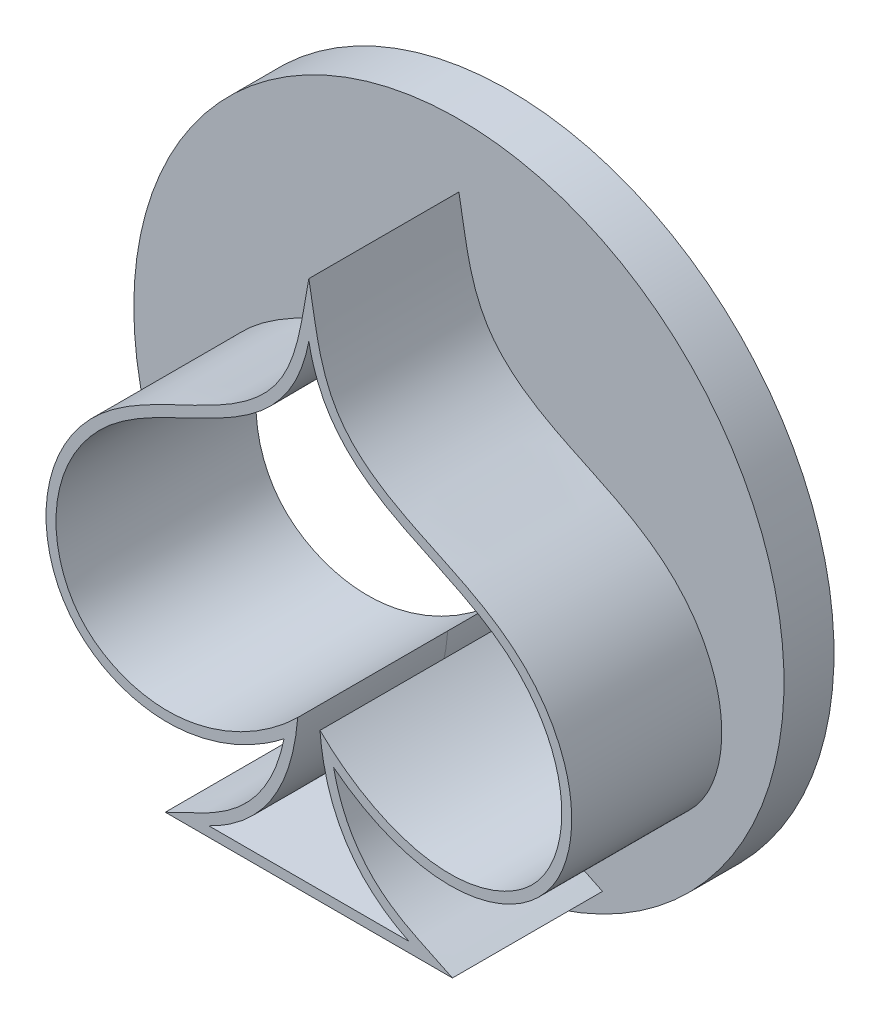
ISO-10303-21;
HEADER;
FILE_DESCRIPTION(('STEP AP214'),'2;1');
FILE_NAME('part.step','',(''),(''),'','','');
FILE_SCHEMA(('AUTOMOTIVE_DESIGN { 1 0 10303 214 1 1 1 1 }'));
ENDSEC;
DATA;
#1=APPLICATION_CONTEXT('core data for automotive mechanical design processes');
#2=APPLICATION_PROTOCOL_DEFINITION('international standard','automotive_design',2000,#1);
#3=PRODUCT_CONTEXT('',#1,'mechanical');
#4=PRODUCT('Part','Part','',(#3));
#5=PRODUCT_RELATED_PRODUCT_CATEGORY('part','',(#4));
#6=PRODUCT_DEFINITION_FORMATION('','',#4);
#7=PRODUCT_DEFINITION_CONTEXT('part definition',#1,'design');
#8=PRODUCT_DEFINITION('design','',#6,#7);
#9=PRODUCT_DEFINITION_SHAPE('','',#8);
#10=(LENGTH_UNIT() NAMED_UNIT(*) SI_UNIT(.MILLI.,.METRE.));
#11=(NAMED_UNIT(*) PLANE_ANGLE_UNIT() SI_UNIT($,.RADIAN.));
#12=(NAMED_UNIT(*) SI_UNIT($,.STERADIAN.) SOLID_ANGLE_UNIT());
#13=UNCERTAINTY_MEASURE_WITH_UNIT(LENGTH_MEASURE(1.E-05),#10,'distance_accuracy_value','');
#14=(GEOMETRIC_REPRESENTATION_CONTEXT(3) GLOBAL_UNCERTAINTY_ASSIGNED_CONTEXT((#13)) GLOBAL_UNIT_ASSIGNED_CONTEXT((#10,
#11,#12)) REPRESENTATION_CONTEXT('',''));
#15=CARTESIAN_POINT('',(0.,0.,0.));
#16=DIRECTION('',(0.,0.,1.));
#17=DIRECTION('',(1.,0.,0.));
#18=AXIS2_PLACEMENT_3D('',#15,#16,#17);
#19=CARTESIAN_POINT('',(-1.28515027166938,0.736448594879229,3.));
#20=DIRECTION('',(0.,0.,1.));
#21=DIRECTION('',(1.,0.,0.));
#22=AXIS2_PLACEMENT_3D('',#19,#20,#21);
#23=PLANE('',#22);
#24=CARTESIAN_POINT('',(-0.494956522938412,2.25945613840665,3.));
#25=CARTESIAN_POINT('',(-0.640678292168768,1.55412408020092,3.));
#26=CARTESIAN_POINT('',(-1.25977908193702,0.714931464463592,3.));
#27=CARTESIAN_POINT('',(-1.8707479629013,0.278116546356921,3.));
#28=CARTESIAN_POINT('',(-2.5381807117026,-0.0364384497359075,3.));
#29=CARTESIAN_POINT('',(-2.87074217972203,-0.2,3.));
#30=B_SPLINE_CURVE_WITH_KNOTS('',2,(#24,#25,#26,#27,#28,#29),.UNSPECIFIED.,.F.,.F.,(3,1,1,1,3),
(-0.242380713308049,0.169631082778639,0.444305613503099,0.650311511546443,0.856317409589788),.UNSPECIFIED.);
#31=CARTESIAN_POINT('',(-0.494956522938412,2.25945613840665,3.));
#32=VERTEX_POINT('',#31);
#33=CARTESIAN_POINT('',(-2.87074217972203,-0.2,3.));
#34=VERTEX_POINT('',#33);
#35=EDGE_CURVE('E308',#32,#34,#30,.T.);
#36=ORIENTED_EDGE('',*,*,#35,.T.);
#37=DIRECTION('',(1.,0.,0.));
#38=VECTOR('',#37,1.);
#39=CARTESIAN_POINT('',(2.87074217972204,-0.200000000000003,3.));
#40=LINE('',#39,#38);
#41=CARTESIAN_POINT('',(2.87074217972204,-0.200000000000003,3.));
#42=VERTEX_POINT('',#41);
#43=EDGE_CURVE('E332',#34,#42,#40,.T.);
#44=ORIENTED_EDGE('',*,*,#43,.T.);
#45=CARTESIAN_POINT('',(2.87074217972204,-0.200000000000003,3.));
#46=CARTESIAN_POINT('',(2.53818071170261,-0.0364384497359103,3.));
#47=CARTESIAN_POINT('',(1.87074796290131,0.278116546356918,3.));
#48=CARTESIAN_POINT('',(1.25977908193702,0.714931464463591,3.));
#49=CARTESIAN_POINT('',(0.640678292168768,1.55412408020092,3.));
#50=CARTESIAN_POINT('',(0.494956522938412,2.25945613840665,3.));
#51=B_SPLINE_CURVE_WITH_KNOTS('',2,(#45,#46,#47,#48,#49,#50),.UNSPECIFIED.,.F.,.F.,(3,1,1,1,3),
(-0.242380713308051,-0.0363748152647065,0.169631082778638,0.444305613503098,0.856317409589788),.UNSPECIFIED.);
#52=CARTESIAN_POINT('',(0.494956522938412,2.25945613840665,3.));
#53=VERTEX_POINT('',#52);
#54=EDGE_CURVE('E329',#42,#53,#51,.T.);
#55=ORIENTED_EDGE('',*,*,#54,.T.);
#56=CARTESIAN_POINT('',(0.494956522938412,2.25945613840665,3.));
#57=CARTESIAN_POINT('',(0.998757074257411,1.86685386097343,3.));
#58=CARTESIAN_POINT('',(1.88650626976387,1.40820300280175,3.));
#59=CARTESIAN_POINT('',(3.19938862171504,1.34104177219629,3.));
#60=CARTESIAN_POINT('',(4.17960344732873,1.65362447461034,3.));
#61=CARTESIAN_POINT('',(4.94557325085865,2.35559702424426,3.));
#62=CARTESIAN_POINT('',(5.40186826022642,3.65429352301547,3.));
#63=CARTESIAN_POINT('',(5.0963399677719,4.99970760772158,3.));
#64=CARTESIAN_POINT('',(4.2679620305338,6.01849755245838,3.));
#65=CARTESIAN_POINT('',(3.48759809705787,6.56116783432404,3.));
#66=CARTESIAN_POINT('',(2.65056429548742,6.96736865480958,3.));
#67=CARTESIAN_POINT('',(1.82978690577659,7.34952389606943,3.));
#68=CARTESIAN_POINT('',(1.10495763586814,7.80017024316994,3.));
#69=CARTESIAN_POINT('',(0.533078904004996,8.40110061833601,3.));
#70=CARTESIAN_POINT('',(0.188909182730846,9.26334657201893,3.));
#71=CARTESIAN_POINT('',(0.0718362272986335,10.0919579296255,3.));
#72=CARTESIAN_POINT('',(0.,10.4746817202019,3.));
#73=B_SPLINE_CURVE_WITH_KNOTS('',3,(#56,#57,#58,#59,#60,#61,#62,#63,#64,#65,#66,#67,#68,#69,#70,
#71,#72),.UNSPECIFIED.,.F.,.F.,(4,1,1,1,1,1,1,1,1,1,1,1,1,1,4),(0.0376212456088501,
0.165142491198778,0.228903113993743,0.292663736788707,0.356424359583671,0.420184982378635,
0.547706227968564,0.611466850763528,0.675227473558492,0.738988096353457,0.802748719148421,
0.866509341943385,0.930269964738349,0.994030587533313,1.05779121032828),.UNSPECIFIED.);
#74=CARTESIAN_POINT('',(0.,10.4746817202019,3.));
#75=VERTEX_POINT('',#74);
#76=EDGE_CURVE('E262',#53,#75,#73,.T.);
#77=ORIENTED_EDGE('',*,*,#76,.T.);
#78=CARTESIAN_POINT('',(0.,10.4746817202019,3.));
#79=CARTESIAN_POINT('',(-0.0718362272986337,10.0919579296255,3.));
#80=CARTESIAN_POINT('',(-0.188909182730845,9.26334657201893,3.));
#81=CARTESIAN_POINT('',(-0.533078904004996,8.40110061833601,3.));
#82=CARTESIAN_POINT('',(-1.10495763586814,7.80017024316994,3.));
#83=CARTESIAN_POINT('',(-1.82978690577659,7.34952389606943,3.));
#84=CARTESIAN_POINT('',(-2.65056429548742,6.96736865480958,3.));
#85=CARTESIAN_POINT('',(-3.48759809705787,6.56116783432403,3.));
#86=CARTESIAN_POINT('',(-4.2679620305338,6.01849755245838,3.));
#87=CARTESIAN_POINT('',(-5.09633996777191,4.99970760772158,3.));
#88=CARTESIAN_POINT('',(-5.40186826022642,3.65429352301547,3.));
#89=CARTESIAN_POINT('',(-4.94557325085865,2.35559702424426,3.));
#90=CARTESIAN_POINT('',(-4.17960344732873,1.65362447461034,3.));
#91=CARTESIAN_POINT('',(-3.19938862171504,1.34104177219629,3.));
#92=CARTESIAN_POINT('',(-1.88650626976387,1.40820300280175,3.));
#93=CARTESIAN_POINT('',(-0.99875707425741,1.86685386097343,3.));
#94=CARTESIAN_POINT('',(-0.494956522938412,2.25945613840665,3.));
#95=B_SPLINE_CURVE_WITH_KNOTS('',3,(#78,#79,#80,#81,#82,#83,#84,#85,#86,#87,#88,#89,#90,#91,#92,
#93,#94),.UNSPECIFIED.,.F.,.F.,(4,1,1,1,1,1,1,1,1,1,1,1,1,1,4),(0.03762124560885,
0.101381868403814,0.165142491198778,0.228903113993743,0.292663736788707,0.356424359583671,
0.420184982378635,0.4839456051736,0.547706227968564,0.675227473558492,0.738988096353456,
0.802748719148421,0.866509341943385,0.930269964738349,1.05779121032828),.UNSPECIFIED.);
#96=EDGE_CURVE('E255',#75,#32,#95,.T.);
#97=ORIENTED_EDGE('',*,*,#96,.T.);
#98=EDGE_LOOP('',(#36,#44,#55,#77,#97));
#99=FACE_BOUND('',#98,.T.);
#100=CARTESIAN_POINT('',(0.,9.39052910293571,3.));
#101=CARTESIAN_POINT('',(-0.434868056542186,7.07367092066314,3.));
#102=CARTESIAN_POINT('',(-3.27332031845501,7.09812649972264,3.));
#103=CARTESIAN_POINT('',(-4.96582828834832,4.80046080988698,3.));
#104=CARTESIAN_POINT('',(-5.15936116752048,3.42594853175549,3.));
#105=CARTESIAN_POINT('',(-4.59672066333842,2.1021145370711,3.));
#106=CARTESIAN_POINT('',(-2.63249516843848,1.17067032531659,3.));
#107=CARTESIAN_POINT('',(-0.980618286637176,2.01669958052137,3.));
#108=CARTESIAN_POINT('',(-0.222681985542157,2.76356171091485,3.));
#109=B_SPLINE_CURVE_WITH_KNOTS('',3,(#100,#101,#102,#103,#104,#105,#106,#107,#108),
.UNSPECIFIED.,.F.,.F.,(4,1,1,1,1,1,4),(0.,0.383556228998472,0.480101645091423,0.580039305715825,
0.663614347310343,0.766755591841274,1.),.UNSPECIFIED.);
#110=CARTESIAN_POINT('',(0.,9.39052910293571,3.));
#111=VERTEX_POINT('',#110);
#112=CARTESIAN_POINT('',(-0.222681985542157,2.76356171091485,3.));
#113=VERTEX_POINT('',#112);
#114=EDGE_CURVE('E227',#111,#113,#109,.T.);
#115=ORIENTED_EDGE('',*,*,#114,.F.);
#116=CARTESIAN_POINT('',(0.222681985542157,2.76356171091485,3.));
#117=CARTESIAN_POINT('',(0.980618286637177,2.01669958052137,3.));
#118=CARTESIAN_POINT('',(2.63249516843848,1.17067032531659,3.));
#119=CARTESIAN_POINT('',(4.59672066333842,2.1021145370711,3.));
#120=CARTESIAN_POINT('',(5.15936116752048,3.42594853175549,3.));
#121=CARTESIAN_POINT('',(4.96582828834832,4.80046080988698,3.));
#122=CARTESIAN_POINT('',(3.27332031845501,7.09812649972264,3.));
#123=CARTESIAN_POINT('',(0.434868056542188,7.07367092066314,3.));
#124=CARTESIAN_POINT('',(0.,9.39052910293571,3.));
#125=B_SPLINE_CURVE_WITH_KNOTS('',3,(#116,#117,#118,#119,#120,#121,#122,#123,#124),
.UNSPECIFIED.,.F.,.F.,(4,1,1,1,1,1,4),(0.,0.233244408158726,0.336385652689657,0.419960694284175,
0.519898354908577,0.616443771001528,1.),.UNSPECIFIED.);
#126=CARTESIAN_POINT('',(0.222681985542157,2.76356171091485,3.));
#127=VERTEX_POINT('',#126);
#128=EDGE_CURVE('E221',#127,#111,#125,.T.);
#129=ORIENTED_EDGE('',*,*,#128,.F.);
#130=CARTESIAN_POINT('',(2.,0.,3.));
#131=CARTESIAN_POINT('',(0.383801434932143,0.783797297675232,3.));
#132=CARTESIAN_POINT('',(0.222681985542157,2.76356171091485,3.));
#133=B_SPLINE_CURVE_WITH_KNOTS('',2,(#130,#131,#132),.UNSPECIFIED.,.F.,.F.,(3,3),(0.,1.),.UNSPECIFIED.);
#134=CARTESIAN_POINT('',(2.,0.,3.));
#135=VERTEX_POINT('',#134);
#136=EDGE_CURVE('E385',#135,#127,#133,.T.);
#137=ORIENTED_EDGE('',*,*,#136,.F.);
#138=DIRECTION('',(1.,0.,0.));
#139=VECTOR('',#138,1.);
#140=CARTESIAN_POINT('',(2.,0.,3.));
#141=LINE('',#140,#139);
#142=CARTESIAN_POINT('',(-2.,0.,3.));
#143=VERTEX_POINT('',#142);
#144=EDGE_CURVE('E406',#143,#135,#141,.T.);
#145=ORIENTED_EDGE('',*,*,#144,.F.);
#146=CARTESIAN_POINT('',(-0.222681985542157,2.76356171091485,3.));
#147=CARTESIAN_POINT('',(-0.383801434932143,0.783797297675232,3.));
#148=CARTESIAN_POINT('',(-2.,0.,3.));
#149=B_SPLINE_CURVE_WITH_KNOTS('',2,(#146,#147,#148),.UNSPECIFIED.,.F.,.F.,(3,3),(0.,1.),.UNSPECIFIED.);
#150=EDGE_CURVE('E421',#113,#143,#149,.T.);
#151=ORIENTED_EDGE('',*,*,#150,.F.);
#152=EDGE_LOOP('',(#115,#129,#137,#145,#151));
#153=FACE_BOUND('',#152,.T.);
#154=ADVANCED_FACE('F39',(#99,#153),#23,.T.);
#155=DIRECTION('',(0.,0.,-1.));
#156=VECTOR('',#155,1.);
#157=SURFACE_OF_LINEAR_EXTRUSION('',#30,#156);
#158=CARTESIAN_POINT('',(-0.494956522938412,2.25945613840665,0.));
#159=CARTESIAN_POINT('',(-0.640678292168768,1.55412408020092,0.));
#160=CARTESIAN_POINT('',(-1.25977908193702,0.714931464463592,0.));
#161=CARTESIAN_POINT('',(-1.8707479629013,0.278116546356921,0.));
#162=CARTESIAN_POINT('',(-2.5381807117026,-0.0364384497359075,0.));
#163=CARTESIAN_POINT('',(-2.87074217972203,-0.2,0.));
#164=B_SPLINE_CURVE_WITH_KNOTS('',2,(#158,#159,#160,#161,#162,#163),.UNSPECIFIED.,.F.,.F.,(3,1,
1,1,3),(-0.242380713308049,0.169631082778639,0.444305613503099,0.650311511546443,
0.856317409589788),.UNSPECIFIED.);
#165=CARTESIAN_POINT('',(-0.494956522938412,2.25945613840665,0.));
#166=VERTEX_POINT('',#165);
#167=CARTESIAN_POINT('',(-2.87074217972203,-0.2,0.));
#168=VERTEX_POINT('',#167);
#169=EDGE_CURVE('E267',#166,#168,#164,.T.);
#170=ORIENTED_EDGE('',*,*,#169,.T.);
#171=DIRECTION('',(0.,0.,-1.));
#172=VECTOR('',#171,1.);
#173=CARTESIAN_POINT('',(-2.87074217972203,-0.2,3.));
#174=LINE('',#173,#172);
#175=EDGE_CURVE('E11',#34,#168,#174,.T.);
#176=ORIENTED_EDGE('',*,*,#175,.F.);
#177=ORIENTED_EDGE('',*,*,#35,.F.);
#178=DIRECTION('',(0.,0.,-1.));
#179=VECTOR('',#178,1.);
#180=CARTESIAN_POINT('',(-0.494956522938412,2.25945613840665,3.));
#181=LINE('',#180,#179);
#182=EDGE_CURVE('E261',#32,#166,#181,.T.);
#183=ORIENTED_EDGE('',*,*,#182,.T.);
#184=EDGE_LOOP('',(#170,#176,#177,#183));
#185=FACE_BOUND('',#184,.T.);
#186=ADVANCED_FACE('F41',(#185),#157,.F.);
#187=CARTESIAN_POINT('',(2.87074217972204,-0.200000000000003,3.));
#188=DIRECTION('',(0.,1.,0.));
#189=DIRECTION('',(-1.,0.,0.));
#190=AXIS2_PLACEMENT_3D('',#187,#188,#189);
#191=PLANE('',#190);
#192=DIRECTION('',(1.,0.,0.));
#193=VECTOR('',#192,1.);
#194=CARTESIAN_POINT('',(2.87074217972204,-0.200000000000003,0.));
#195=LINE('',#194,#193);
#196=CARTESIAN_POINT('',(2.87074217972204,-0.200000000000003,0.));
#197=VERTEX_POINT('',#196);
#198=EDGE_CURVE('E276',#168,#197,#195,.T.);
#199=ORIENTED_EDGE('',*,*,#198,.T.);
#200=DIRECTION('',(0.,0.,-1.));
#201=VECTOR('',#200,1.);
#202=CARTESIAN_POINT('',(2.87074217972204,-0.200000000000003,3.));
#203=LINE('',#202,#201);
#204=EDGE_CURVE('E49',#42,#197,#203,.T.);
#205=ORIENTED_EDGE('',*,*,#204,.F.);
#206=ORIENTED_EDGE('',*,*,#43,.F.);
#207=ORIENTED_EDGE('',*,*,#175,.T.);
#208=EDGE_LOOP('',(#199,#205,#206,#207));
#209=FACE_BOUND('',#208,.T.);
#210=ADVANCED_FACE('F331',(#209),#191,.F.);
#211=DIRECTION('',(0.,0.,-1.));
#212=VECTOR('',#211,1.);
#213=SURFACE_OF_LINEAR_EXTRUSION('',#51,#212);
#214=CARTESIAN_POINT('',(2.87074217972204,-0.200000000000003,0.));
#215=CARTESIAN_POINT('',(2.53818071170261,-0.0364384497359103,0.));
#216=CARTESIAN_POINT('',(1.87074796290131,0.278116546356918,0.));
#217=CARTESIAN_POINT('',(1.25977908193702,0.714931464463591,0.));
#218=CARTESIAN_POINT('',(0.640678292168768,1.55412408020092,0.));
#219=CARTESIAN_POINT('',(0.494956522938412,2.25945613840665,0.));
#220=B_SPLINE_CURVE_WITH_KNOTS('',2,(#214,#215,#216,#217,#218,#219),.UNSPECIFIED.,.F.,.F.,(3,1,
1,1,3),(-0.242380713308051,-0.0363748152647065,0.169631082778638,0.444305613503098,
0.856317409589788),.UNSPECIFIED.);
#221=CARTESIAN_POINT('',(0.494956522938412,2.25945613840665,0.));
#222=VERTEX_POINT('',#221);
#223=EDGE_CURVE('E284',#197,#222,#220,.T.);
#224=ORIENTED_EDGE('',*,*,#223,.T.);
#225=DIRECTION('',(0.,0.,-1.));
#226=VECTOR('',#225,1.);
#227=CARTESIAN_POINT('',(0.494956522938412,2.25945613840665,3.));
#228=LINE('',#227,#226);
#229=EDGE_CURVE('E319',#53,#222,#228,.T.);
#230=ORIENTED_EDGE('',*,*,#229,.F.);
#231=ORIENTED_EDGE('',*,*,#54,.F.);
#232=ORIENTED_EDGE('',*,*,#204,.T.);
#233=EDGE_LOOP('',(#224,#230,#231,#232));
#234=FACE_BOUND('',#233,.T.);
#235=ADVANCED_FACE('F327',(#234),#213,.F.);
#236=DIRECTION('',(0.,0.,-1.));
#237=VECTOR('',#236,1.);
#238=SURFACE_OF_LINEAR_EXTRUSION('',#73,#237);
#239=CARTESIAN_POINT('',(0.494956522938412,2.25945613840665,0.));
#240=CARTESIAN_POINT('',(0.998757074257411,1.86685386097343,0.));
#241=CARTESIAN_POINT('',(1.88650626976387,1.40820300280175,0.));
#242=CARTESIAN_POINT('',(3.19938862171504,1.34104177219629,0.));
#243=CARTESIAN_POINT('',(4.17960344732873,1.65362447461034,0.));
#244=CARTESIAN_POINT('',(4.94557325085865,2.35559702424426,0.));
#245=CARTESIAN_POINT('',(5.40186826022642,3.65429352301547,0.));
#246=CARTESIAN_POINT('',(5.0963399677719,4.99970760772158,0.));
#247=CARTESIAN_POINT('',(4.2679620305338,6.01849755245838,0.));
#248=CARTESIAN_POINT('',(3.48759809705787,6.56116783432404,0.));
#249=CARTESIAN_POINT('',(2.65056429548742,6.96736865480958,0.));
#250=CARTESIAN_POINT('',(1.82978690577659,7.34952389606943,0.));
#251=CARTESIAN_POINT('',(1.10495763586814,7.80017024316994,0.));
#252=CARTESIAN_POINT('',(0.533078904004996,8.40110061833601,0.));
#253=CARTESIAN_POINT('',(0.188909182730846,9.26334657201893,0.));
#254=CARTESIAN_POINT('',(0.0718362272986335,10.0919579296255,0.));
#255=CARTESIAN_POINT('',(0.,10.4746817202019,0.));
#256=B_SPLINE_CURVE_WITH_KNOTS('',3,(#239,#240,#241,#242,#243,#244,#245,#246,#247,#248,#249,
#250,#251,#252,#253,#254,#255),.UNSPECIFIED.,.F.,.F.,(4,1,1,1,1,1,1,1,1,1,1,1,1,1,4),
(0.0376212456088501,0.165142491198778,0.228903113993743,0.292663736788707,0.356424359583671,
0.420184982378635,0.547706227968564,0.611466850763528,0.675227473558492,0.738988096353457,
0.802748719148421,0.866509341943385,0.930269964738349,0.994030587533313,1.05779121032828),.UNSPECIFIED.);
#257=CARTESIAN_POINT('',(0.,10.4746817202019,0.));
#258=VERTEX_POINT('',#257);
#259=EDGE_CURVE('E290',#222,#258,#256,.T.);
#260=ORIENTED_EDGE('',*,*,#259,.T.);
#261=DIRECTION('',(0.,0.,-1.));
#262=VECTOR('',#261,1.);
#263=CARTESIAN_POINT('',(0.,10.4746817202019,3.));
#264=LINE('',#263,#262);
#265=EDGE_CURVE('E315',#75,#258,#264,.T.);
#266=ORIENTED_EDGE('',*,*,#265,.F.);
#267=ORIENTED_EDGE('',*,*,#76,.F.);
#268=ORIENTED_EDGE('',*,*,#229,.T.);
#269=EDGE_LOOP('',(#260,#266,#267,#268));
#270=FACE_BOUND('',#269,.T.);
#271=ADVANCED_FACE('F251',(#270),#238,.F.);
#272=DIRECTION('',(0.,0.,-1.));
#273=VECTOR('',#272,1.);
#274=SURFACE_OF_LINEAR_EXTRUSION('',#95,#273);
#275=CARTESIAN_POINT('',(0.,10.4746817202019,0.));
#276=CARTESIAN_POINT('',(-0.0718362272986337,10.0919579296255,0.));
#277=CARTESIAN_POINT('',(-0.188909182730845,9.26334657201893,0.));
#278=CARTESIAN_POINT('',(-0.533078904004996,8.40110061833601,0.));
#279=CARTESIAN_POINT('',(-1.10495763586814,7.80017024316994,0.));
#280=CARTESIAN_POINT('',(-1.82978690577659,7.34952389606943,0.));
#281=CARTESIAN_POINT('',(-2.65056429548742,6.96736865480958,0.));
#282=CARTESIAN_POINT('',(-3.48759809705787,6.56116783432403,0.));
#283=CARTESIAN_POINT('',(-4.2679620305338,6.01849755245838,0.));
#284=CARTESIAN_POINT('',(-5.09633996777191,4.99970760772158,0.));
#285=CARTESIAN_POINT('',(-5.40186826022642,3.65429352301547,0.));
#286=CARTESIAN_POINT('',(-4.94557325085865,2.35559702424426,0.));
#287=CARTESIAN_POINT('',(-4.17960344732873,1.65362447461034,0.));
#288=CARTESIAN_POINT('',(-3.19938862171504,1.34104177219629,0.));
#289=CARTESIAN_POINT('',(-1.88650626976387,1.40820300280175,0.));
#290=CARTESIAN_POINT('',(-0.99875707425741,1.86685386097343,0.));
#291=CARTESIAN_POINT('',(-0.494956522938412,2.25945613840665,0.));
#292=B_SPLINE_CURVE_WITH_KNOTS('',3,(#275,#276,#277,#278,#279,#280,#281,#282,#283,#284,#285,
#286,#287,#288,#289,#290,#291),.UNSPECIFIED.,.F.,.F.,(4,1,1,1,1,1,1,1,1,1,1,1,1,1,4),
(0.03762124560885,0.101381868403814,0.165142491198778,0.228903113993743,0.292663736788707,
0.356424359583671,0.420184982378635,0.4839456051736,0.547706227968564,0.675227473558492,
0.738988096353456,0.802748719148421,0.866509341943385,0.930269964738349,1.05779121032828),.UNSPECIFIED.);
#293=EDGE_CURVE('E299',#258,#166,#292,.T.);
#294=ORIENTED_EDGE('',*,*,#293,.T.);
#295=ORIENTED_EDGE('',*,*,#182,.F.);
#296=ORIENTED_EDGE('',*,*,#96,.F.);
#297=ORIENTED_EDGE('',*,*,#265,.T.);
#298=EDGE_LOOP('',(#294,#295,#296,#297));
#299=FACE_BOUND('',#298,.T.);
#300=ADVANCED_FACE('F242',(#299),#274,.F.);
#301=DIRECTION('',(0.,0.,-1.));
#302=VECTOR('',#301,1.);
#303=SURFACE_OF_LINEAR_EXTRUSION('',#125,#302);
#304=DIRECTION('',(0.,0.,-1.));
#305=VECTOR('',#304,1.);
#306=CARTESIAN_POINT('',(0.,9.39052910293571,3.));
#307=LINE('',#306,#305);
#308=CARTESIAN_POINT('',(0.,9.39052910293571,-1.));
#309=VERTEX_POINT('',#308);
#310=EDGE_CURVE('E277',#111,#309,#307,.T.);
#311=ORIENTED_EDGE('',*,*,#310,.T.);
#312=CARTESIAN_POINT('',(0.222681985542157,2.76356171091485,-1.));
#313=CARTESIAN_POINT('',(0.267622056781547,2.71928577677275,-1.));
#314=CARTESIAN_POINT('',(0.31349998928929,2.67597517329728,-1.));
#315=CARTESIAN_POINT('',(0.407029080906865,2.59131545631004,-1.));
#316=CARTESIAN_POINT('',(0.454680183953779,2.54996628087701,-1.));
#317=CARTESIAN_POINT('',(0.600249127704799,2.42881542700386,-1.));
#318=CARTESIAN_POINT('',(0.700684612769739,2.35200666738486,-1.));
#319=CARTESIAN_POINT('',(0.908916710004572,2.20606825255957,-1.));
#320=CARTESIAN_POINT('',(1.01679124628147,2.1370497907428,-1.));
#321=CARTESIAN_POINT('',(1.23815922963595,2.00885510242047,-1.));
#322=CARTESIAN_POINT('',(1.35164928833726,1.94967303244401,-1.));
#323=CARTESIAN_POINT('',(1.63121068259429,1.82051206900407,-1.));
#324=CARTESIAN_POINT('',(1.79985244673728,1.75597106292279,-1.));
#325=CARTESIAN_POINT('',(2.14464373163098,1.65421497623771,-1.));
#326=CARTESIAN_POINT('',(2.32075136533008,1.61686449594489,-0.999999999999999));
#327=CARTESIAN_POINT('',(2.57127168435125,1.58738390540625,-0.999999999999999));
#328=CARTESIAN_POINT('',(2.64418662916815,1.58157350623224,-1.));
#329=CARTESIAN_POINT('',(2.79023435217834,1.57578270171406,-1.));
#330=CARTESIAN_POINT('',(2.86336700595512,1.57579943762001,-1.));
#331=CARTESIAN_POINT('',(3.00949109954939,1.58197581681789,-1.));
#332=CARTESIAN_POINT('',(3.08248214783871,1.58814493049124,-1.));
#333=CARTESIAN_POINT('',(3.22764854248767,1.60687296775651,-1.));
#334=CARTESIAN_POINT('',(3.29982384835278,1.61943220715096,-1.));
#335=CARTESIAN_POINT('',(3.44311361458721,1.65092080324736,-1.));
#336=CARTESIAN_POINT('',(3.51422177914243,1.66987879198122,-1.));
#337=CARTESIAN_POINT('',(3.6544818226186,1.71406258599073,-1.));
#338=CARTESIAN_POINT('',(3.72363338166238,1.73928940961195,-1.));
#339=CARTESIAN_POINT('',(3.85923750467927,1.79600989605734,-1.));
#340=CARTESIAN_POINT('',(3.92569289939353,1.82749676998538,-1.));
#341=CARTESIAN_POINT('',(4.05519450806776,1.89683035595428,-1.));
#342=CARTESIAN_POINT('',(4.1182420775996,1.93467451420384,-1.));
#343=CARTESIAN_POINT('',(4.22303926305223,2.00535989871127,-1.));
#344=CARTESIAN_POINT('',(4.26583208309256,2.03666129919902,-1.));
#345=CARTESIAN_POINT('',(4.34874508352348,2.10261511741933,-1.));
#346=CARTESIAN_POINT('',(4.38886605944883,2.1372665300923,-1.));
#347=CARTESIAN_POINT('',(4.46591476387261,2.20981998508368,-1.));
#348=CARTESIAN_POINT('',(4.50284866519567,2.24771544695057,-1.));
#349=CARTESIAN_POINT('',(4.57313923560761,2.32669309410974,-1.));
#350=CARTESIAN_POINT('',(4.6064957203669,2.36777544342147,-1.));
#351=CARTESIAN_POINT('',(4.66951219221098,2.45256466403628,-1.));
#352=CARTESIAN_POINT('',(4.69917847026863,2.49626687515585,-1.));
#353=CARTESIAN_POINT('',(4.75487552784782,2.58591922954496,-1.));
#354=CARTESIAN_POINT('',(4.78090594580278,2.63186959576869,-1.));
#355=CARTESIAN_POINT('',(4.85368028864161,2.77268077437917,-1.));
#356=CARTESIAN_POINT('',(4.89501903603852,2.87038053560259,-1.));
#357=CARTESIAN_POINT('',(4.96655059814431,3.07903668008785,-1.));
#358=CARTESIAN_POINT('',(4.99549599225565,3.19041374706198,-1.));
#359=CARTESIAN_POINT('',(5.03702882968097,3.41608105485557,-1.));
#360=CARTESIAN_POINT('',(5.04962514091122,3.53036968208173,-1.));
#361=CARTESIAN_POINT('',(5.05966056695347,3.77794014091653,-1.));
#362=CARTESIAN_POINT('',(5.05434970905915,3.91133293662866,-1.));
#363=CARTESIAN_POINT('',(5.02366479875753,4.1758532126712,-1.));
#364=CARTESIAN_POINT('',(4.99827661704857,4.30697903119733,-1.));
#365=CARTESIAN_POINT('',(4.94438947804425,4.5065395851324,-1.));
#366=CARTESIAN_POINT('',(4.92235815158813,4.57678797040575,-1.));
#367=CARTESIAN_POINT('',(4.8727925050649,4.71531182689739,-1.));
#368=CARTESIAN_POINT('',(4.84525809412611,4.78358726551535,-1.));
#369=CARTESIAN_POINT('',(4.75475757598813,4.98496491424996,-1.));
#370=CARTESIAN_POINT('',(4.68389331160966,5.11462164174916,-1.));
#371=CARTESIAN_POINT('',(4.56071840363227,5.30583843240395,-1.));
#372=CARTESIAN_POINT('',(4.51462497239112,5.37155285153426,-1.));
#373=CARTESIAN_POINT('',(4.41754273540564,5.49929341869541,-1.));
#374=CARTESIAN_POINT('',(4.36655364409333,5.56131935123156,-1.));
#375=CARTESIAN_POINT('',(4.26017400629629,5.68126635216038,-1.));
#376=CARTESIAN_POINT('',(4.20479181722557,5.7391948362101,-1.));
#377=CARTESIAN_POINT('',(4.11862716379497,5.82287313302239,-1.));
#378=CARTESIAN_POINT('',(4.0893907470789,5.85022985698623,-1.));
#379=CARTESIAN_POINT('',(4.02991882470363,5.90383548913049,-1.));
#380=CARTESIAN_POINT('',(3.99968329461386,5.93008437018586,-1.));
#381=CARTESIAN_POINT('',(3.87158887125746,6.0373734895619,-1.));
#382=CARTESIAN_POINT('',(3.76957998062017,6.11350625026119,-1.));
#383=CARTESIAN_POINT('',(3.55928477397878,6.25655080499442,-1.));
#384=CARTESIAN_POINT('',(3.45099133752663,6.32345183775475,-1.));
#385=CARTESIAN_POINT('',(3.22981829259601,6.45080300284625,-1.));
#386=CARTESIAN_POINT('',(3.11691387129178,6.51120934396943,-1.));
#387=CARTESIAN_POINT('',(2.88900865978161,6.62772335899669,-1.));
#388=CARTESIAN_POINT('',(2.77400867543033,6.68383264389232,-1.));
#389=CARTESIAN_POINT('',(2.54045793752188,6.79582451769229,-1.));
#390=CARTESIAN_POINT('',(2.42188892925483,6.85166828859025,-1.));
#391=CARTESIAN_POINT('',(2.18529904660218,6.96462586035931,-1.));
#392=CARTESIAN_POINT('',(2.06727835011546,7.02174004277346,-1.));
#393=CARTESIAN_POINT('',(1.83382654430484,7.13992970391876,-1.));
#394=CARTESIAN_POINT('',(1.71838658138083,7.20098737262379,-1.));
#395=CARTESIAN_POINT('',(1.49156031598222,7.330236474864,-1.));
#396=CARTESIAN_POINT('',(1.38017125304895,7.39842292293337,-1.));
#397=CARTESIAN_POINT('',(1.20382247394499,7.51781597809433,-1.));
#398=CARTESIAN_POINT('',(1.13685560766636,7.56604259928834,-1.));
#399=CARTESIAN_POINT('',(1.00644321035488,7.66702468799005,-1.));
#400=CARTESIAN_POINT('',(0.942996199077976,7.71977822760337,-1.));
#401=CARTESIAN_POINT('',(0.820601685173918,7.83012546814743,-1.));
#402=CARTESIAN_POINT('',(0.761647674140455,7.88771190386748,-1.));
#403=CARTESIAN_POINT('',(0.649052943721855,8.00787471651368,-1.));
#404=CARTESIAN_POINT('',(0.595411652467803,8.07045055506148,-1.));
#405=CARTESIAN_POINT('',(0.493797267653571,8.2008903177362,-1.));
#406=CARTESIAN_POINT('',(0.445874559159919,8.26879359097577,-1.));
#407=CARTESIAN_POINT('',(0.35673741067147,8.40887844002312,-1.));
#408=CARTESIAN_POINT('',(0.31552380377321,8.4810605456352,-1.));
#409=CARTESIAN_POINT('',(0.239904102514157,8.62909619133101,-1.));
#410=CARTESIAN_POINT('',(0.205513399480177,8.70495756245296,-1.));
#411=CARTESIAN_POINT('',(0.143499716146948,8.85936317957292,-1.));
#412=CARTESIAN_POINT('',(0.115875116116354,8.93790677833489,-1.));
#413=CARTESIAN_POINT('',(0.0725462981032761,9.0787947564956,-1.));
#414=CARTESIAN_POINT('',(0.0555601791418356,9.1407522020407,-1.));
#415=CARTESIAN_POINT('',(0.0251884975628481,9.26522238623135,-1.));
#416=CARTESIAN_POINT('',(0.011785578281883,9.32773087503549,-1.));
#417=CARTESIAN_POINT('',(0.,9.39052910293571,-1.));
#418=B_SPLINE_CURVE_WITH_KNOTS('',3,(#312,#313,#314,#315,#316,#317,#318,#319,#320,#321,#322,
#323,#324,#325,#326,#327,#328,#329,#330,#331,#332,#333,#334,#335,#336,#337,#338,#339,#340,#341,
#342,#343,#344,#345,#346,#347,#348,#349,#350,#351,#352,#353,#354,#355,#356,#357,#358,#359,#360,
#361,#362,#363,#364,#365,#366,#367,#368,#369,#370,#371,#372,#373,#374,#375,#376,#377,#378,#379,
#380,#381,#382,#383,#384,#385,#386,#387,#388,#389,#390,#391,#392,#393,#394,#395,#396,#397,#398,
#399,#400,#401,#402,#403,#404,#405,#406,#407,#408,#409,#410,#411,#412,#413,#414,#415,#416,#417),
.UNSPECIFIED.,.F.,.F.,(4,2,2,2,2,2,2,2,2,2,2,2,2,2,2,2,2,2,2,2,2,2,2,2,2,2,2,2,2,2,2,2,2,2,2,2,
2,2,2,2,2,2,2,2,2,2,2,2,2,2,2,2,4),(0.,0.189228974810152,0.378451971780365,0.757308742315284,
1.14102730812844,1.52451709845056,2.06438178527939,2.60153938674879,2.82079141792841,
3.03993588581544,3.25941820519241,3.47891137252542,3.69940000613989,3.91992448063641,
4.14021109272373,4.36040942393762,4.51931178243406,4.67816661464569,4.83670652242361,
4.99525459519131,5.15352856288443,5.31181825887643,5.62884231889042,5.97283686289965,
6.31664474253005,6.7155040887789,7.11464438006798,7.33530205208209,7.55596336808725,
7.99727620247004,8.23790284977435,8.47854354157176,8.71873694015845,8.83883080914312,
8.9589276168687,9.34004287829272,9.72159871290073,10.1055842397815,10.4894250962516,
10.8826163035007,11.2759272364447,11.6675716498997,12.0589439786234,12.3063563047835,
12.5536637826079,12.8006059274385,13.0475214621007,13.2964729751223,13.5454553779279,
13.7949932117327,14.0444712503851,14.2371020744506,14.4287821755271),.UNSPECIFIED.);
#419=CARTESIAN_POINT('',(0.222681985542157,2.76356171091485,-1.));
#420=VERTEX_POINT('',#419);
#421=EDGE_CURVE('E197',#420,#309,#418,.T.);
#422=ORIENTED_EDGE('',*,*,#421,.F.);
#423=DIRECTION('',(0.,0.,1.));
#424=VECTOR('',#423,1.);
#425=CARTESIAN_POINT('',(0.222681985542157,2.76356171091485,-1.));
#426=LINE('',#425,#424);
#427=CARTESIAN_POINT('',(0.222681985542157,2.76356171091485,0.));
#428=VERTEX_POINT('',#427);
#429=EDGE_CURVE('E190',#420,#428,#426,.T.);
#430=ORIENTED_EDGE('',*,*,#429,.T.);
#431=DIRECTION('',(0.,0.,-1.));
#432=VECTOR('',#431,1.);
#433=CARTESIAN_POINT('',(0.222681985542157,2.76356171091485,3.));
#434=LINE('',#433,#432);
#435=EDGE_CURVE('E381',#127,#428,#434,.T.);
#436=ORIENTED_EDGE('',*,*,#435,.F.);
#437=ORIENTED_EDGE('',*,*,#128,.T.);
#438=EDGE_LOOP('',(#311,#422,#430,#436,#437));
#439=FACE_BOUND('',#438,.T.);
#440=ADVANCED_FACE('F237',(#439),#303,.T.);
#441=DIRECTION('',(0.,0.,-1.));
#442=VECTOR('',#441,1.);
#443=SURFACE_OF_LINEAR_EXTRUSION('',#109,#442);
#444=DIRECTION('',(0.,0.,-1.));
#445=VECTOR('',#444,1.);
#446=CARTESIAN_POINT('',(-0.222681985542157,2.76356171091485,3.));
#447=LINE('',#446,#445);
#448=CARTESIAN_POINT('',(-0.222681985542157,2.76356171091485,0.));
#449=VERTEX_POINT('',#448);
#450=EDGE_CURVE('E372',#113,#449,#447,.T.);
#451=ORIENTED_EDGE('',*,*,#450,.T.);
#452=DIRECTION('',(0.,0.,-1.));
#453=VECTOR('',#452,1.);
#454=CARTESIAN_POINT('',(-0.222681985542157,2.76356171091485,-1.));
#455=LINE('',#454,#453);
#456=CARTESIAN_POINT('',(-0.222681985542157,2.76356171091485,-1.));
#457=VERTEX_POINT('',#456);
#458=EDGE_CURVE('E184',#457,#449,#455,.F.);
#459=ORIENTED_EDGE('',*,*,#458,.F.);
#460=CARTESIAN_POINT('',(0.,9.39052910293571,-1.));
#461=CARTESIAN_POINT('',(-0.0112002040403278,9.33084747882254,-1.));
#462=CARTESIAN_POINT('',(-0.0238625911357684,9.27142452257609,-1.));
#463=CARTESIAN_POINT('',(-0.0523610928825155,9.15320499775834,-1.));
#464=CARTESIAN_POINT('',(-0.0682043105765255,9.09441014692283,-1.));
#465=CARTESIAN_POINT('',(-0.103276115111434,8.9777914504718,-1.));
#466=CARTESIAN_POINT('',(-0.122506798494655,8.91996823062904,-1.));
#467=CARTESIAN_POINT('',(-0.164356078562471,8.80607412473955,-1.));
#468=CARTESIAN_POINT('',(-0.186946764634291,8.74999301630482,-1.));
#469=CARTESIAN_POINT('',(-0.235722526660977,8.63945837308705,-1.));
#470=CARTESIAN_POINT('',(-0.261905001604738,8.58500369495222,-1.));
#471=CARTESIAN_POINT('',(-0.317891729303107,8.47802023871611,-1.));
#472=CARTESIAN_POINT('',(-0.347694445984739,8.42549065602447,-1.));
#473=CARTESIAN_POINT('',(-0.423553569630922,8.30198754851917,-1.));
#474=CARTESIAN_POINT('',(-0.471335715910218,8.23206383319226,-1.));
#475=CARTESIAN_POINT('',(-0.573436571248097,8.09715416568422,-1.));
#476=CARTESIAN_POINT('',(-0.627757098569744,8.03216959526813,-1.));
#477=CARTESIAN_POINT('',(-0.741954154441386,7.90763674904036,-1.));
#478=CARTESIAN_POINT('',(-0.80181470867272,7.84807376831719,-1.));
#479=CARTESIAN_POINT('',(-0.926219751028162,7.73414303965772,-1.));
#480=CARTESIAN_POINT('',(-0.990762858410284,7.67977377112107,-1.));
#481=CARTESIAN_POINT('',(-1.20496508867548,7.51214431851198,-1.));
#482=CARTESIAN_POINT('',(-1.36202406565698,7.40834312878933,-1.));
#483=CARTESIAN_POINT('',(-1.60467025488992,7.26489919695171,-1.));
#484=CARTESIAN_POINT('',(-1.68687258882128,7.21906092582248,-1.));
#485=CARTESIAN_POINT('',(-1.8528684128223,7.13034550007234,-1.));
#486=CARTESIAN_POINT('',(-1.93666165051185,7.08746788069762,-1.));
#487=CARTESIAN_POINT('',(-2.19132554556573,6.96066676266663,-1.));
#488=CARTESIAN_POINT('',(-2.36358680478647,6.87962464330354,-1.));
#489=CARTESIAN_POINT('',(-2.70722504557857,6.71628680011663,-1.));
#490=CARTESIAN_POINT('',(-2.87860299321668,6.63399325460674,-1.));
#491=CARTESIAN_POINT('',(-3.14275784898683,6.49723990514982,-1.));
#492=CARTESIAN_POINT('',(-3.23729136068539,6.44624805502623,-1.));
#493=CARTESIAN_POINT('',(-3.42365880355127,6.3394156278363,-1.));
#494=CARTESIAN_POINT('',(-3.51549163885633,6.28357311787056,-1.));
#495=CARTESIAN_POINT('',(-3.69447922461415,6.16595048691839,-1.));
#496=CARTESIAN_POINT('',(-3.7816609691343,6.10421221600864,-1.));
#497=CARTESIAN_POINT('',(-3.90813087734564,6.00610566951738,-1.));
#498=CARTESIAN_POINT('',(-3.94956388500426,5.97249298995045,-1.));
#499=CARTESIAN_POINT('',(-4.03076908321208,5.9033209557344,-1.));
#500=CARTESIAN_POINT('',(-4.07054136224194,5.86776170502897,-1.));
#501=CARTESIAN_POINT('',(-4.17211617464941,5.77229491215684,-1.));
#502=CARTESIAN_POINT('',(-4.23247124770015,5.7108288402367,-1.));
#503=CARTESIAN_POINT('',(-4.34806153453507,5.58328354937871,-1.));
#504=CARTESIAN_POINT('',(-4.40329535774224,5.51720308598089,-1.));
#505=CARTESIAN_POINT('',(-4.56090721236277,5.31210518470256,-1.));
#506=CARTESIAN_POINT('',(-4.6549809283436,5.16643220153483,-1.));
#507=CARTESIAN_POINT('',(-4.77594713956327,4.93710759466871,-1.));
#508=CARTESIAN_POINT('',(-4.81298408105674,4.85863766879758,-1.));
#509=CARTESIAN_POINT('',(-4.87962982216283,4.69856123942592,-1.));
#510=CARTESIAN_POINT('',(-4.90923808715126,4.61695451066427,-1.));
#511=CARTESIAN_POINT('',(-4.96063105019119,4.45141748581567,-1.));
#512=CARTESIAN_POINT('',(-4.98242527293115,4.36749015375793,-1.));
#513=CARTESIAN_POINT('',(-5.01788658957367,4.19797708797174,-1.));
#514=CARTESIAN_POINT('',(-5.03155442133897,4.11239150553854,-1.));
#515=CARTESIAN_POINT('',(-5.0578943261431,3.87118082619629,-1.));
#516=CARTESIAN_POINT('',(-5.06101502854391,3.71432040403505,-1.));
#517=CARTESIAN_POINT('',(-5.04340215744105,3.48092098844119,-1.));
#518=CARTESIAN_POINT('',(-5.0338028714712,3.40338965939163,-1.));
#519=CARTESIAN_POINT('',(-5.00705907586183,3.24964999215088,-1.));
#520=CARTESIAN_POINT('',(-4.98991634616256,3.17344134626794,-1.));
#521=CARTESIAN_POINT('',(-4.93776799845529,2.98625701484657,-1.));
#522=CARTESIAN_POINT('',(-4.89812659198984,2.87650415900873,-1.));
#523=CARTESIAN_POINT('',(-4.82579427777292,2.71802548682643,-1.));
#524=CARTESIAN_POINT('',(-4.79956912888304,2.66627010283411,-1.));
#525=CARTESIAN_POINT('',(-4.74274048691835,2.56519800593337,-1.));
#526=CARTESIAN_POINT('',(-4.71213711313721,2.51588122662944,-1.));
#527=CARTESIAN_POINT('',(-4.64629453049616,2.41987126572791,-1.));
#528=CARTESIAN_POINT('',(-4.61102130322278,2.37320132116242,-1.));
#529=CARTESIAN_POINT('',(-4.53603091850623,2.28358463128379,-1.));
#530=CARTESIAN_POINT('',(-4.49631445841356,2.240637303591,-1.));
#531=CARTESIAN_POINT('',(-4.41286310318094,2.15872861338915,-1.));
#532=CARTESIAN_POINT('',(-4.3691226101912,2.11977296784748,-1.));
#533=CARTESIAN_POINT('',(-4.27833416210649,2.0459479202307,-1.));
#534=CARTESIAN_POINT('',(-4.23128514559347,2.01107983915666,-1.));
#535=CARTESIAN_POINT('',(-4.07666575633414,1.90630356145389,-1.));
#536=CARTESIAN_POINT('',(-3.9637288511802,1.84410018960579,-1.));
#537=CARTESIAN_POINT('',(-3.78810095315575,1.76530684488821,-1.));
#538=CARTESIAN_POINT('',(-3.72846842174781,1.74144706368381,-1.));
#539=CARTESIAN_POINT('',(-3.60748150708802,1.69849649636132,-1.));
#540=CARTESIAN_POINT('',(-3.54612709388937,1.67940579324384,-1.));
#541=CARTESIAN_POINT('',(-3.42146874814476,1.64584006719025,-1.));
#542=CARTESIAN_POINT('',(-3.35815097032199,1.6314166958839,-1.));
#543=CARTESIAN_POINT('',(-3.23059534045926,1.60757096137892,-1.));
#544=CARTESIAN_POINT('',(-3.16635757162378,1.59814814882387,-1.));
#545=CARTESIAN_POINT('',(-2.97301540371337,1.57739487346463,-1.));
#546=CARTESIAN_POINT('',(-2.84305475687217,1.57351892493815,-1.));
#547=CARTESIAN_POINT('',(-2.57065844874499,1.58468124637808,-1.));
#548=CARTESIAN_POINT('',(-2.42831617579769,1.60170819715143,-1.));
#549=CARTESIAN_POINT('',(-2.14719702482694,1.6551383221143,-1.));
#550=CARTESIAN_POINT('',(-2.00842759023196,1.69157897914856,-1.));
#551=CARTESIAN_POINT('',(-1.65719947026519,1.80686942262932,-1.));
#552=CARTESIAN_POINT('',(-1.44873085571359,1.89805793168788,-1.));
#553=CARTESIAN_POINT('',(-1.14929505534886,2.05865886714347,-1.));
#554=CARTESIAN_POINT('',(-1.0516053523119,2.11623015098348,-1.));
#555=CARTESIAN_POINT('',(-0.860891056388736,2.23863629318759,-1.));
#556=CARTESIAN_POINT('',(-0.767864450080999,2.30346797687666,-1.));
#557=CARTESIAN_POINT('',(-0.597227656314056,2.43200920446423,-1.));
#558=CARTESIAN_POINT('',(-0.519071447255868,2.49499830911951,-1.));
#559=CARTESIAN_POINT('',(-0.367406756983187,2.62573034844515,-1.));
#560=CARTESIAN_POINT('',(-0.293880361473077,2.69345250647177,-1.));
#561=CARTESIAN_POINT('',(-0.222681985542157,2.76356171091485,-1.));
#562=B_SPLINE_CURVE_WITH_KNOTS('',3,(#460,#461,#462,#463,#464,#465,#466,#467,#468,#469,#470,
#471,#472,#473,#474,#475,#476,#477,#478,#479,#480,#481,#482,#483,#484,#485,#486,#487,#488,#489,
#490,#491,#492,#493,#494,#495,#496,#497,#498,#499,#500,#501,#502,#503,#504,#505,#506,#507,#508,
#509,#510,#511,#512,#513,#514,#515,#516,#517,#518,#519,#520,#521,#522,#523,#524,#525,#526,#527,
#528,#529,#530,#531,#532,#533,#534,#535,#536,#537,#538,#539,#540,#541,#542,#543,#544,#545,#546,
#547,#548,#549,#550,#551,#552,#553,#554,#555,#556,#557,#558,#559,#560,#561),.UNSPECIFIED.,.F.,
.F.,(4,2,2,2,2,2,2,2,2,2,2,2,2,2,2,2,2,2,2,2,2,2,2,2,2,2,2,2,2,2,2,2,2,2,2,2,2,2,2,2,2,2,2,2,2,
2,2,2,2,2,4),(0.,0.182175410516429,0.364762250612933,0.547462495466763,0.728722085396606,
0.909851101484911,1.09090353100882,1.34455049922679,1.59826816798908,1.85127578913149,
2.10420910691906,2.6670282182907,2.94938754703865,3.23170245066211,3.80281728577405,
4.37303153572072,4.69515522697215,5.01740787270734,5.33752258154107,5.49752691025548,
5.65752270331983,5.91563670356686,6.17382058571208,6.69106115824277,6.9510846781175,
7.21112690590232,7.47085107681274,7.730551661599,8.19809619711171,8.43215425722448,
8.66615711892024,9.01459223156149,9.18848340608245,9.36236984348573,9.53760092636272,
9.71280454578941,9.88825568746099,10.0637633752518,10.4482198822221,10.6407724812731,
10.8333284312587,11.0279477251494,11.2225495273464,11.6110549479845,12.0395645301709,
12.4689044679376,13.1474964823431,13.4874575761389,13.8272705950618,14.1282006671977,
14.4278839659261),.UNSPECIFIED.);
#563=EDGE_CURVE('E144',#309,#457,#562,.T.);
#564=ORIENTED_EDGE('',*,*,#563,.F.);
#565=ORIENTED_EDGE('',*,*,#310,.F.);
#566=ORIENTED_EDGE('',*,*,#114,.T.);
#567=EDGE_LOOP('',(#451,#459,#564,#565,#566));
#568=FACE_BOUND('',#567,.T.);
#569=ADVANCED_FACE('F241',(#568),#443,.T.);
#570=DIRECTION('',(0.,0.,-1.));
#571=VECTOR('',#570,1.);
#572=SURFACE_OF_LINEAR_EXTRUSION('',#149,#571);
#573=CARTESIAN_POINT('',(-0.222681985542157,2.76356171091485,0.));
#574=CARTESIAN_POINT('',(-0.383801434932143,0.783797297675232,0.));
#575=CARTESIAN_POINT('',(-2.,0.,0.));
#576=B_SPLINE_CURVE_WITH_KNOTS('',2,(#573,#574,#575),.UNSPECIFIED.,.F.,.F.,(3,3),(0.,1.),.UNSPECIFIED.);
#577=CARTESIAN_POINT('',(-2.,0.,0.));
#578=VERTEX_POINT('',#577);
#579=EDGE_CURVE('E138',#449,#578,#576,.T.);
#580=ORIENTED_EDGE('',*,*,#579,.F.);
#581=ORIENTED_EDGE('',*,*,#450,.F.);
#582=ORIENTED_EDGE('',*,*,#150,.T.);
#583=DIRECTION('',(0.,0.,-1.));
#584=VECTOR('',#583,1.);
#585=CARTESIAN_POINT('',(-2.,0.,3.));
#586=LINE('',#585,#584);
#587=EDGE_CURVE('E376',#143,#578,#586,.T.);
#588=ORIENTED_EDGE('',*,*,#587,.T.);
#589=EDGE_LOOP('',(#580,#581,#582,#588));
#590=FACE_BOUND('',#589,.T.);
#591=ADVANCED_FACE('F418',(#590),#572,.T.);
#592=CARTESIAN_POINT('',(2.,0.,3.));
#593=DIRECTION('',(0.,1.,0.));
#594=DIRECTION('',(0.,0.,1.));
#595=AXIS2_PLACEMENT_3D('',#592,#593,#594);
#596=PLANE('',#595);
#597=DIRECTION('',(0.,0.,-1.));
#598=VECTOR('',#597,1.);
#599=CARTESIAN_POINT('',(2.,0.,3.));
#600=LINE('',#599,#598);
#601=CARTESIAN_POINT('',(2.,0.,0.));
#602=VERTEX_POINT('',#601);
#603=EDGE_CURVE('E64',#135,#602,#600,.T.);
#604=ORIENTED_EDGE('',*,*,#603,.T.);
#605=DIRECTION('',(0.,0.,1.));
#606=VECTOR('',#605,1.);
#607=CARTESIAN_POINT('',(2.,0.,-1.));
#608=LINE('',#607,#606);
#609=CARTESIAN_POINT('',(2.,0.,-1.));
#610=VERTEX_POINT('',#609);
#611=EDGE_CURVE('E143',#610,#602,#608,.T.);
#612=ORIENTED_EDGE('',*,*,#611,.F.);
#613=DIRECTION('',(1.,0.,0.));
#614=VECTOR('',#613,1.);
#615=CARTESIAN_POINT('',(-2.,0.,-1.));
#616=LINE('',#615,#614);
#617=CARTESIAN_POINT('',(-2.,0.,-1.));
#618=VERTEX_POINT('',#617);
#619=EDGE_CURVE('E147',#618,#610,#616,.T.);
#620=ORIENTED_EDGE('',*,*,#619,.F.);
#621=DIRECTION('',(0.,0.,1.));
#622=VECTOR('',#621,1.);
#623=CARTESIAN_POINT('',(-2.,0.,-1.));
#624=LINE('',#623,#622);
#625=EDGE_CURVE('E131',#618,#578,#624,.T.);
#626=ORIENTED_EDGE('',*,*,#625,.T.);
#627=ORIENTED_EDGE('',*,*,#587,.F.);
#628=ORIENTED_EDGE('',*,*,#144,.T.);
#629=EDGE_LOOP('',(#604,#612,#620,#626,#627,#628));
#630=FACE_BOUND('',#629,.T.);
#631=ADVANCED_FACE('F148',(#630),#596,.T.);
#632=DIRECTION('',(0.,0.,-1.));
#633=VECTOR('',#632,1.);
#634=SURFACE_OF_LINEAR_EXTRUSION('',#133,#633);
#635=CARTESIAN_POINT('',(2.,0.,0.));
#636=CARTESIAN_POINT('',(0.383801434932143,0.783797297675232,0.));
#637=CARTESIAN_POINT('',(0.222681985542157,2.76356171091485,0.));
#638=B_SPLINE_CURVE_WITH_KNOTS('',2,(#635,#636,#637),.UNSPECIFIED.,.F.,.F.,(3,3),(0.,1.),.UNSPECIFIED.);
#639=EDGE_CURVE('E228',#602,#428,#638,.T.);
#640=ORIENTED_EDGE('',*,*,#639,.F.);
#641=ORIENTED_EDGE('',*,*,#603,.F.);
#642=ORIENTED_EDGE('',*,*,#136,.T.);
#643=ORIENTED_EDGE('',*,*,#435,.T.);
#644=EDGE_LOOP('',(#640,#641,#642,#643));
#645=FACE_BOUND('',#644,.T.);
#646=ADVANCED_FACE('F411',(#645),#634,.T.);
#647=CARTESIAN_POINT('',(0.,5.23734086010095,-1.));
#648=DIRECTION('',(0.,0.,1.));
#649=DIRECTION('',(1.,0.,0.));
#650=AXIS2_PLACEMENT_3D('',#647,#648,#649);
#651=CYLINDRICAL_SURFACE('',#650,6.5);
#652=CARTESIAN_POINT('',(0.,5.23734086010095,-1.));
#653=DIRECTION('',(0.,0.,-1.));
#654=DIRECTION('',(-1.,0.,0.));
#655=AXIS2_PLACEMENT_3D('',#652,#653,#654);
#656=CIRCLE('',#655,6.5);
#657=CARTESIAN_POINT('',(-6.5,5.23734086010095,-1.));
#658=VERTEX_POINT('',#657);
#659=EDGE_CURVE('E214',#658,#658,#656,.T.);
#660=ORIENTED_EDGE('',*,*,#659,.F.);
#661=EDGE_LOOP('',(#660));
#662=FACE_BOUND('',#661,.T.);
#663=CARTESIAN_POINT('',(0.,5.23734086010095,0.));
#664=DIRECTION('',(0.,0.,-1.));
#665=DIRECTION('',(-1.,0.,0.));
#666=AXIS2_PLACEMENT_3D('',#663,#664,#665);
#667=CIRCLE('',#666,6.5);
#668=CARTESIAN_POINT('',(-6.5,5.23734086010095,0.));
#669=VERTEX_POINT('',#668);
#670=EDGE_CURVE('E189',#669,#669,#667,.T.);
#671=ORIENTED_EDGE('',*,*,#670,.T.);
#672=EDGE_LOOP('',(#671));
#673=FACE_BOUND('',#672,.T.);
#674=ADVANCED_FACE('F415',(#662,#673),#651,.T.);
#675=CARTESIAN_POINT('',(0.,5.23734086010095,-1.));
#676=DIRECTION('',(0.,0.,-1.));
#677=DIRECTION('',(-1.,0.,0.));
#678=AXIS2_PLACEMENT_3D('',#675,#676,#677);
#679=PLANE('',#678);
#680=CARTESIAN_POINT('',(-771028.829331925,636806.635098421,-1.));
#681=CARTESIAN_POINT('',(772536.858045759,-634967.961015674,-1.));
#682=CARTESIAN_POINT('',(-774048.657230114,633132.547031609,-1.));
#683=B_SPLINE_CURVE_WITH_KNOTS('',2,(#680,#681,#682),.UNSPECIFIED.,.F.,.F.,(3,3),(0.,1.),.UNSPECIFIED.);
#684=EDGE_CURVE('E135',#457,#618,#683,.T.);
#685=ORIENTED_EDGE('',*,*,#684,.T.);
#686=ORIENTED_EDGE('',*,*,#619,.T.);
#687=CARTESIAN_POINT('',(774048.657230114,633132.547031609,-1.));
#688=CARTESIAN_POINT('',(-772536.858045759,-634967.961015674,-1.));
#689=CARTESIAN_POINT('',(771028.829331925,636806.635098422,-1.));
#690=B_SPLINE_CURVE_WITH_KNOTS('',2,(#687,#688,#689),.UNSPECIFIED.,.F.,.F.,(3,3),(0.,1.),.UNSPECIFIED.);
#691=EDGE_CURVE('E56',#610,#420,#690,.T.);
#692=ORIENTED_EDGE('',*,*,#691,.T.);
#693=ORIENTED_EDGE('',*,*,#421,.T.);
#694=ORIENTED_EDGE('',*,*,#563,.T.);
#695=EDGE_LOOP('',(#685,#686,#692,#693,#694));
#696=FACE_BOUND('',#695,.T.);
#697=ORIENTED_EDGE('',*,*,#659,.T.);
#698=EDGE_LOOP('',(#697));
#699=FACE_BOUND('',#698,.T.);
#700=ADVANCED_FACE('F152',(#696,#699),#679,.T.);
#701=CARTESIAN_POINT('',(0.,5.23734086010095,0.));
#702=DIRECTION('',(0.,0.,-1.));
#703=DIRECTION('',(-1.,0.,0.));
#704=AXIS2_PLACEMENT_3D('',#701,#702,#703);
#705=PLANE('',#704);
#706=ORIENTED_EDGE('',*,*,#169,.F.);
#707=ORIENTED_EDGE('',*,*,#293,.F.);
#708=ORIENTED_EDGE('',*,*,#259,.F.);
#709=ORIENTED_EDGE('',*,*,#223,.F.);
#710=ORIENTED_EDGE('',*,*,#198,.F.);
#711=EDGE_LOOP('',(#706,#707,#708,#709,#710));
#712=FACE_BOUND('',#711,.T.);
#713=ORIENTED_EDGE('',*,*,#670,.F.);
#714=EDGE_LOOP('',(#713));
#715=FACE_BOUND('',#714,.T.);
#716=ADVANCED_FACE('F170',(#712,#715),#705,.F.);
#717=DIRECTION('',(0.,0.,1.));
#718=VECTOR('',#717,1.);
#719=SURFACE_OF_LINEAR_EXTRUSION('',#683,#718);
#720=ORIENTED_EDGE('',*,*,#579,.T.);
#721=ORIENTED_EDGE('',*,*,#625,.F.);
#722=ORIENTED_EDGE('',*,*,#684,.F.);
#723=ORIENTED_EDGE('',*,*,#458,.T.);
#724=EDGE_LOOP('',(#720,#721,#722,#723));
#725=FACE_BOUND('',#724,.T.);
#726=ADVANCED_FACE('F133',(#725),#719,.F.);
#727=DIRECTION('',(0.,0.,1.));
#728=VECTOR('',#727,1.);
#729=SURFACE_OF_LINEAR_EXTRUSION('',#690,#728);
#730=ORIENTED_EDGE('',*,*,#639,.T.);
#731=ORIENTED_EDGE('',*,*,#429,.F.);
#732=ORIENTED_EDGE('',*,*,#691,.F.);
#733=ORIENTED_EDGE('',*,*,#611,.T.);
#734=EDGE_LOOP('',(#730,#731,#732,#733));
#735=FACE_BOUND('',#734,.T.);
#736=ADVANCED_FACE('F169',(#735),#729,.F.);
#737=CLOSED_SHELL('',(#154,#186,#210,#235,#271,#300,#440,#569,#591,#631,#646,#674,#700,#716,
#726,#736));
#738=MANIFOLD_SOLID_BREP('B2',#737);
#739=ADVANCED_BREP_SHAPE_REPRESENTATION('',(#18,#738),#14);
#740=SHAPE_DEFINITION_REPRESENTATION(#9,#739);
ENDSEC;
END-ISO-10303-21;
